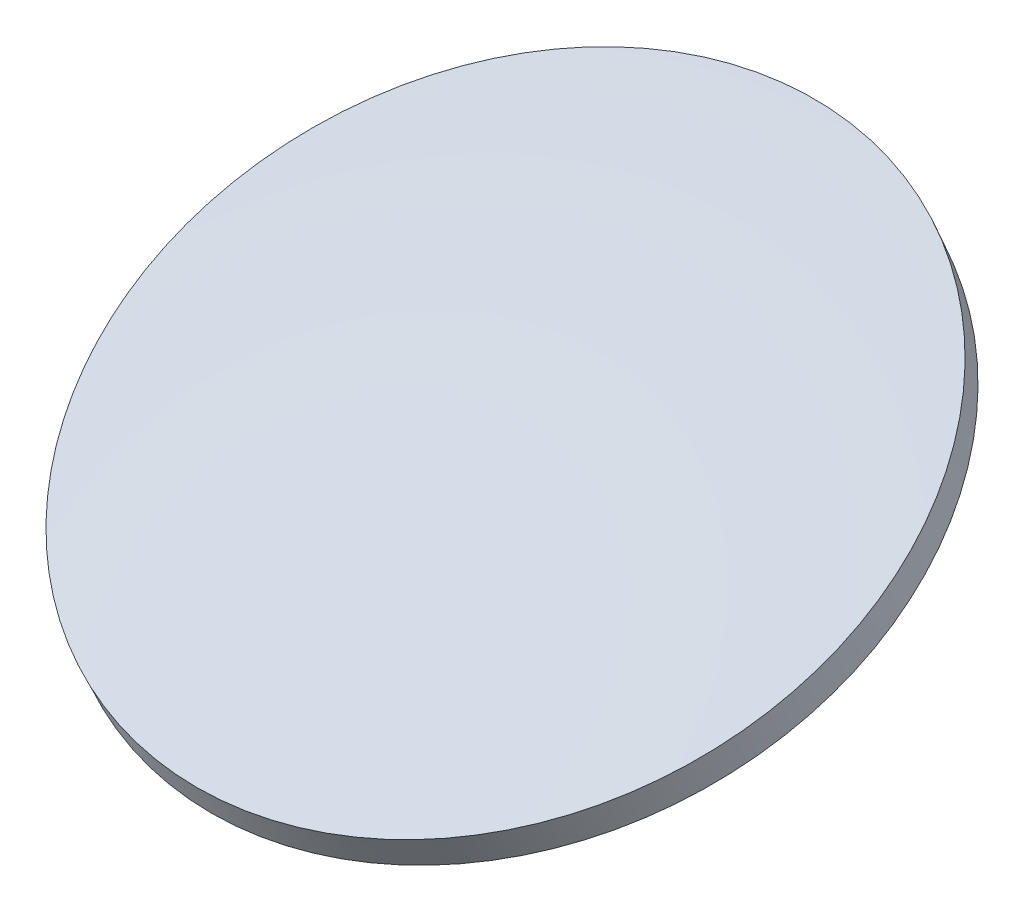
ISO-10303-21;
HEADER;
FILE_DESCRIPTION(('STEP AP214'),'2;1');
FILE_NAME('part.step','',(''),(''),'','','');
FILE_SCHEMA(('AUTOMOTIVE_DESIGN { 1 0 10303 214 1 1 1 1 }'));
ENDSEC;
DATA;
#1=APPLICATION_CONTEXT('core data for automotive mechanical design processes');
#2=APPLICATION_PROTOCOL_DEFINITION('international standard','automotive_design',2000,#1);
#3=PRODUCT_CONTEXT('',#1,'mechanical');
#4=PRODUCT('Part','Part','',(#3));
#5=PRODUCT_RELATED_PRODUCT_CATEGORY('part','',(#4));
#6=PRODUCT_DEFINITION_FORMATION('','',#4);
#7=PRODUCT_DEFINITION_CONTEXT('part definition',#1,'design');
#8=PRODUCT_DEFINITION('design','',#6,#7);
#9=PRODUCT_DEFINITION_SHAPE('','',#8);
#10=(LENGTH_UNIT() NAMED_UNIT(*) SI_UNIT(.MILLI.,.METRE.));
#11=(NAMED_UNIT(*) PLANE_ANGLE_UNIT() SI_UNIT($,.RADIAN.));
#12=(NAMED_UNIT(*) SI_UNIT($,.STERADIAN.) SOLID_ANGLE_UNIT());
#13=UNCERTAINTY_MEASURE_WITH_UNIT(LENGTH_MEASURE(1.E-05),#10,'distance_accuracy_value','');
#14=(GEOMETRIC_REPRESENTATION_CONTEXT(3) GLOBAL_UNCERTAINTY_ASSIGNED_CONTEXT((#13)) GLOBAL_UNIT_ASSIGNED_CONTEXT((#10,
#11,#12)) REPRESENTATION_CONTEXT('',''));
#15=CARTESIAN_POINT('',(0.,0.,0.));
#16=DIRECTION('',(0.,0.,1.));
#17=DIRECTION('',(1.,0.,0.));
#18=AXIS2_PLACEMENT_3D('',#15,#16,#17);
#19=CARTESIAN_POINT('',(0.,34.4279466394021,21.1198822843278));
#20=DIRECTION('',(0.,0.90630778703665,0.4226182617407));
#21=DIRECTION('',(0.,0.4226182617407,-0.90630778703665));
#22=AXIS2_PLACEMENT_3D('',#19,#20,#21);
#23=CONICAL_SURFACE('',#22,4.12327516472783,1.1647582702333);
#24=CARTESIAN_POINT('',(0.,33.3879193922716,20.634909614301));
#25=DIRECTION('',(0.,-0.90630778703665,-0.4226182617407));
#26=DIRECTION('',(1.,0.,0.));
#27=AXIS2_PLACEMENT_3D('',#24,#25,#26);
#28=CIRCLE('',#27,1.45412897742512);
#29=CARTESIAN_POINT('',(-1.45412897742512,33.3879193922716,20.634909614301));
#30=VERTEX_POINT('',#29);
#31=CARTESIAN_POINT('',(0.,32.7733779314854,21.952798029897));
#32=VERTEX_POINT('',#31);
#33=EDGE_CURVE('E46',#30,#32,#28,.T.);
#34=ORIENTED_EDGE('',*,*,#33,.F.);
#35=CARTESIAN_POINT('',(0.,33.3879193922716,20.634909614301));
#36=DIRECTION('',(0.,-0.90630778703665,-0.4226182617407));
#37=DIRECTION('',(1.,0.,0.));
#38=AXIS2_PLACEMENT_3D('',#35,#36,#37);
#39=CIRCLE('',#38,1.45412897742512);
#40=EDGE_CURVE('E77',#32,#30,#39,.T.);
#41=ORIENTED_EDGE('',*,*,#40,.F.);
#42=DIRECTION('',(0.,-0.0302896229311635,0.999541164106155));
#43=VECTOR('',#42,1.);
#44=CARTESIAN_POINT('',(0.,32.6853752566062,24.8568386742155));
#45=LINE('',#44,#43);
#46=CARTESIAN_POINT('',(0.,32.597372581727,27.7608793185339));
#47=VERTEX_POINT('',#46);
#48=EDGE_CURVE('E11',#32,#47,#45,.T.);
#49=ORIENTED_EDGE('',*,*,#48,.T.);
#50=CARTESIAN_POINT('',(0.,35.4679738865326,21.6048549543546));
#51=DIRECTION('',(0.,-0.90630778703665,-0.4226182617407));
#52=DIRECTION('',(1.,0.,0.));
#53=AXIS2_PLACEMENT_3D('',#50,#51,#52);
#54=CIRCLE('',#53,6.79242135203055);
#55=EDGE_CURVE('E105',#47,#47,#54,.T.);
#56=ORIENTED_EDGE('',*,*,#55,.T.);
#57=ORIENTED_EDGE('',*,*,#48,.F.);
#58=EDGE_LOOP('',(#34,#41,#49,#56,#57));
#59=FACE_BOUND('',#58,.T.);
#60=ADVANCED_FACE('F42',(#59),#23,.T.);
#61=CARTESIAN_POINT('',(0.,35.7662737287063,21.7439544551867));
#62=DIRECTION('',(0.,0.90630778703665,0.4226182617407));
#63=DIRECTION('',(0.,0.4226182617407,-0.90630778703665));
#64=AXIS2_PLACEMENT_3D('',#61,#62,#63);
#65=CONICAL_SURFACE('',#64,6.79981769938443,0.0224681284604717);
#66=ORIENTED_EDGE('',*,*,#55,.F.);
#67=DIRECTION('',(0.,0.896584394458132,0.442872920389297));
#68=VECTOR('',#67,1.);
#69=CARTESIAN_POINT('',(0.,32.8925465924388,27.9066821865684));
#70=LINE('',#69,#68);
#71=CARTESIAN_POINT('',(0.,33.1877206031506,28.0524850546029));
#72=VERTEX_POINT('',#71);
#73=EDGE_CURVE('E52',#47,#72,#70,.T.);
#74=ORIENTED_EDGE('',*,*,#73,.T.);
#75=CARTESIAN_POINT('',(0.,36.06457357088,21.8830539560187));
#76=DIRECTION('',(0.,-0.90630778703665,-0.4226182617407));
#77=DIRECTION('',(1.,0.,0.));
#78=AXIS2_PLACEMENT_3D('',#75,#76,#77);
#79=CIRCLE('',#78,6.8072140467383);
#80=CARTESIAN_POINT('',(-6.8072140467383,36.06457357088,21.8830539560187));
#81=VERTEX_POINT('',#80);
#82=EDGE_CURVE('E100',#72,#81,#79,.T.);
#83=ORIENTED_EDGE('',*,*,#82,.T.);
#84=CARTESIAN_POINT('',(0.,36.06457357088,21.8830539560187));
#85=DIRECTION('',(0.,-0.90630778703665,-0.4226182617407));
#86=DIRECTION('',(1.,0.,0.));
#87=AXIS2_PLACEMENT_3D('',#84,#85,#86);
#88=CIRCLE('',#87,6.8072140467383);
#89=EDGE_CURVE('E76',#81,#72,#88,.T.);
#90=ORIENTED_EDGE('',*,*,#89,.T.);
#91=ORIENTED_EDGE('',*,*,#73,.F.);
#92=EDGE_LOOP('',(#66,#74,#83,#90,#91));
#93=FACE_BOUND('',#92,.T.);
#94=ADVANCED_FACE('F81',(#93),#65,.T.);
#95=CARTESIAN_POINT('',(0.,5.03199473906812,7.41232479444609));
#96=DIRECTION('',(0.,0.90630778703665,0.4226182617407));
#97=DIRECTION('',(1.,0.,0.));
#98=AXIS2_PLACEMENT_3D('',#95,#96,#97);
#99=SPHERICAL_SURFACE('',#98,34.9107592942107);
#100=ORIENTED_EDGE('',*,*,#89,.F.);
#101=CARTESIAN_POINT('',(0.,5.03199473906812,7.41232479444609));
#102=DIRECTION('',(0.,-0.4226182617407,0.90630778703665));
#103=DIRECTION('',(-1.,0.,0.));
#104=AXIS2_PLACEMENT_3D('',#101,#102,#103);
#105=CIRCLE('',#104,34.9107592942107);
#106=CARTESIAN_POINT('',(0.,36.6718877387733,22.1662492034134));
#107=VERTEX_POINT('',#106);
#108=EDGE_CURVE('E98',#107,#81,#105,.T.);
#109=ORIENTED_EDGE('',*,*,#108,.F.);
#110=ORIENTED_EDGE('',*,*,#108,.T.);
#111=ORIENTED_EDGE('',*,*,#82,.F.);
#112=EDGE_LOOP('',(#100,#109,#110,#111));
#113=FACE_BOUND('',#112,.T.);
#114=ADVANCED_FACE('F86',(#113),#99,.T.);
#115=CARTESIAN_POINT('',(0.,31.7993938175065,19.894167973613));
#116=DIRECTION('',(0.,0.90630778703665,0.4226182617407));
#117=DIRECTION('',(1.,0.,0.));
#118=AXIS2_PLACEMENT_3D('',#115,#116,#117);
#119=SPHERICAL_SURFACE('',#118,2.27741141713995);
#120=ORIENTED_EDGE('',*,*,#33,.T.);
#121=ORIENTED_EDGE('',*,*,#40,.T.);
#122=CARTESIAN_POINT('',(0.,31.7993938175065,19.894167973613));
#123=DIRECTION('',(0.,-0.4226182617407,0.90630778703665));
#124=DIRECTION('',(-1.,0.,0.));
#125=AXIS2_PLACEMENT_3D('',#122,#123,#124);
#126=CIRCLE('',#125,2.27741141713995);
#127=CARTESIAN_POINT('',(0.,33.8634295191466,20.8566436279931));
#128=VERTEX_POINT('',#127);
#129=EDGE_CURVE('E74',#128,#30,#126,.T.);
#130=ORIENTED_EDGE('',*,*,#129,.F.);
#131=ORIENTED_EDGE('',*,*,#129,.T.);
#132=EDGE_LOOP('',(#120,#121,#130,#131));
#133=FACE_BOUND('',#132,.T.);
#134=ADVANCED_FACE('F44',(#133),#119,.F.);
#135=CLOSED_SHELL('',(#60,#94,#114,#134));
#136=MANIFOLD_SOLID_BREP('B2',#135);
#137=ADVANCED_BREP_SHAPE_REPRESENTATION('',(#18,#136),#14);
#138=SHAPE_DEFINITION_REPRESENTATION(#9,#137);
ENDSEC;
END-ISO-10303-21;
